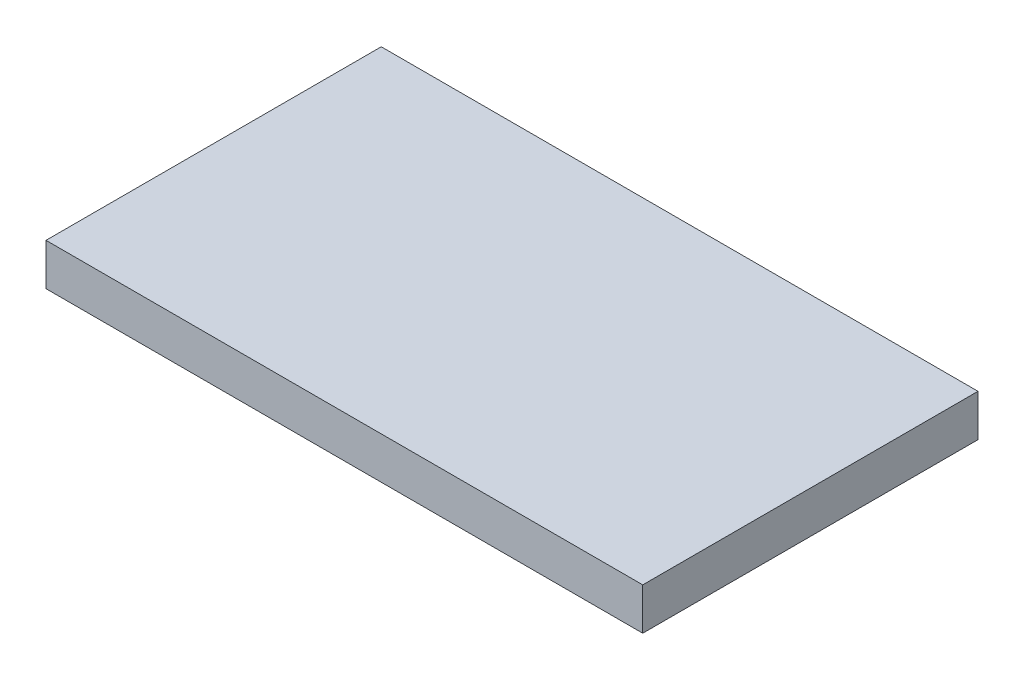
ISO-10303-21;
HEADER;
FILE_DESCRIPTION(('STEP AP214'),'2;1');
FILE_NAME('part.step','',(''),(''),'','','');
FILE_SCHEMA(('AUTOMOTIVE_DESIGN { 1 0 10303 214 1 1 1 1 }'));
ENDSEC;
DATA;
#1=APPLICATION_CONTEXT('core data for automotive mechanical design processes');
#2=APPLICATION_PROTOCOL_DEFINITION('international standard','automotive_design',2000,#1);
#3=PRODUCT_CONTEXT('',#1,'mechanical');
#4=PRODUCT('Part','Part','',(#3));
#5=PRODUCT_RELATED_PRODUCT_CATEGORY('part','',(#4));
#6=PRODUCT_DEFINITION_FORMATION('','',#4);
#7=PRODUCT_DEFINITION_CONTEXT('part definition',#1,'design');
#8=PRODUCT_DEFINITION('design','',#6,#7);
#9=PRODUCT_DEFINITION_SHAPE('','',#8);
#10=(LENGTH_UNIT() NAMED_UNIT(*) SI_UNIT(.MILLI.,.METRE.));
#11=(NAMED_UNIT(*) PLANE_ANGLE_UNIT() SI_UNIT($,.RADIAN.));
#12=(NAMED_UNIT(*) SI_UNIT($,.STERADIAN.) SOLID_ANGLE_UNIT());
#13=UNCERTAINTY_MEASURE_WITH_UNIT(LENGTH_MEASURE(1.E-05),#10,'distance_accuracy_value','');
#14=(GEOMETRIC_REPRESENTATION_CONTEXT(3) GLOBAL_UNCERTAINTY_ASSIGNED_CONTEXT((#13)) GLOBAL_UNIT_ASSIGNED_CONTEXT((#10,
#11,#12)) REPRESENTATION_CONTEXT('',''));
#15=CARTESIAN_POINT('',(0.,0.,0.));
#16=DIRECTION('',(0.,0.,1.));
#17=DIRECTION('',(1.,0.,0.));
#18=AXIS2_PLACEMENT_3D('',#15,#16,#17);
#19=CARTESIAN_POINT('',(8.9,1.25,-5.));
#20=DIRECTION('',(-1.,0.,0.));
#21=DIRECTION('',(0.,0.,1.));
#22=AXIS2_PLACEMENT_3D('',#19,#20,#21);
#23=PLANE('',#22);
#24=DIRECTION('',(0.,0.,-1.));
#25=VECTOR('',#24,1.);
#26=CARTESIAN_POINT('',(8.9,0.,-5.));
#27=LINE('',#26,#25);
#28=CARTESIAN_POINT('',(8.9,0.,5.));
#29=VERTEX_POINT('',#28);
#30=CARTESIAN_POINT('',(8.9,0.,-5.));
#31=VERTEX_POINT('',#30);
#32=EDGE_CURVE('E107',#29,#31,#27,.T.);
#33=ORIENTED_EDGE('',*,*,#32,.T.);
#34=DIRECTION('',(0.,-1.,0.));
#35=VECTOR('',#34,1.);
#36=CARTESIAN_POINT('',(8.9,1.25,-5.));
#37=LINE('',#36,#35);
#38=CARTESIAN_POINT('',(8.9,1.25,-5.));
#39=VERTEX_POINT('',#38);
#40=EDGE_CURVE('E11',#39,#31,#37,.T.);
#41=ORIENTED_EDGE('',*,*,#40,.F.);
#42=DIRECTION('',(0.,0.,-1.));
#43=VECTOR('',#42,1.);
#44=CARTESIAN_POINT('',(8.9,1.25,-5.));
#45=LINE('',#44,#43);
#46=CARTESIAN_POINT('',(8.9,1.25,5.));
#47=VERTEX_POINT('',#46);
#48=EDGE_CURVE('E91',#47,#39,#45,.T.);
#49=ORIENTED_EDGE('',*,*,#48,.F.);
#50=DIRECTION('',(0.,-1.,0.));
#51=VECTOR('',#50,1.);
#52=CARTESIAN_POINT('',(8.9,1.25,5.));
#53=LINE('',#52,#51);
#54=EDGE_CURVE('E103',#47,#29,#53,.T.);
#55=ORIENTED_EDGE('',*,*,#54,.T.);
#56=EDGE_LOOP('',(#33,#41,#49,#55));
#57=FACE_BOUND('',#56,.T.);
#58=ADVANCED_FACE('F39',(#57),#23,.F.);
#59=CARTESIAN_POINT('',(-8.9,1.25,-5.));
#60=DIRECTION('',(0.,0.,1.));
#61=DIRECTION('',(1.,0.,0.));
#62=AXIS2_PLACEMENT_3D('',#59,#60,#61);
#63=PLANE('',#62);
#64=DIRECTION('',(-1.,0.,0.));
#65=VECTOR('',#64,1.);
#66=CARTESIAN_POINT('',(-8.9,0.,-5.));
#67=LINE('',#66,#65);
#68=CARTESIAN_POINT('',(-8.9,0.,-5.));
#69=VERTEX_POINT('',#68);
#70=EDGE_CURVE('E96',#31,#69,#67,.T.);
#71=ORIENTED_EDGE('',*,*,#70,.T.);
#72=DIRECTION('',(0.,-1.,0.));
#73=VECTOR('',#72,1.);
#74=CARTESIAN_POINT('',(-8.9,1.25,-5.));
#75=LINE('',#74,#73);
#76=CARTESIAN_POINT('',(-8.9,1.25,-5.));
#77=VERTEX_POINT('',#76);
#78=EDGE_CURVE('E48',#77,#69,#75,.T.);
#79=ORIENTED_EDGE('',*,*,#78,.F.);
#80=DIRECTION('',(-1.,0.,0.));
#81=VECTOR('',#80,1.);
#82=CARTESIAN_POINT('',(-8.9,1.25,-5.));
#83=LINE('',#82,#81);
#84=EDGE_CURVE('E86',#39,#77,#83,.T.);
#85=ORIENTED_EDGE('',*,*,#84,.F.);
#86=ORIENTED_EDGE('',*,*,#40,.T.);
#87=EDGE_LOOP('',(#71,#79,#85,#86));
#88=FACE_BOUND('',#87,.T.);
#89=ADVANCED_FACE('F95',(#88),#63,.F.);
#90=CARTESIAN_POINT('',(-8.9,1.25,-5.));
#91=DIRECTION('',(1.,0.,0.));
#92=DIRECTION('',(0.,0.,-1.));
#93=AXIS2_PLACEMENT_3D('',#90,#91,#92);
#94=PLANE('',#93);
#95=DIRECTION('',(0.,0.,1.));
#96=VECTOR('',#95,1.);
#97=CARTESIAN_POINT('',(-8.9,0.,-5.));
#98=LINE('',#97,#96);
#99=CARTESIAN_POINT('',(-8.9,0.,5.));
#100=VERTEX_POINT('',#99);
#101=EDGE_CURVE('E73',#69,#100,#98,.T.);
#102=ORIENTED_EDGE('',*,*,#101,.T.);
#103=DIRECTION('',(0.,-1.,0.));
#104=VECTOR('',#103,1.);
#105=CARTESIAN_POINT('',(-8.9,1.25,5.));
#106=LINE('',#105,#104);
#107=CARTESIAN_POINT('',(-8.9,1.25,5.));
#108=VERTEX_POINT('',#107);
#109=EDGE_CURVE('E98',#108,#100,#106,.T.);
#110=ORIENTED_EDGE('',*,*,#109,.F.);
#111=DIRECTION('',(0.,0.,1.));
#112=VECTOR('',#111,1.);
#113=CARTESIAN_POINT('',(-8.9,1.25,-5.));
#114=LINE('',#113,#112);
#115=EDGE_CURVE('E89',#77,#108,#114,.T.);
#116=ORIENTED_EDGE('',*,*,#115,.F.);
#117=ORIENTED_EDGE('',*,*,#78,.T.);
#118=EDGE_LOOP('',(#102,#110,#116,#117));
#119=FACE_BOUND('',#118,.T.);
#120=ADVANCED_FACE('F99',(#119),#94,.F.);
#121=CARTESIAN_POINT('',(-8.9,1.25,5.));
#122=DIRECTION('',(0.,0.,-1.));
#123=DIRECTION('',(-1.,0.,0.));
#124=AXIS2_PLACEMENT_3D('',#121,#122,#123);
#125=PLANE('',#124);
#126=DIRECTION('',(1.,0.,0.));
#127=VECTOR('',#126,1.);
#128=CARTESIAN_POINT('',(-8.9,0.,5.));
#129=LINE('',#128,#127);
#130=EDGE_CURVE('E79',#100,#29,#129,.T.);
#131=ORIENTED_EDGE('',*,*,#130,.T.);
#132=ORIENTED_EDGE('',*,*,#54,.F.);
#133=DIRECTION('',(1.,0.,0.));
#134=VECTOR('',#133,1.);
#135=CARTESIAN_POINT('',(-8.9,1.25,5.));
#136=LINE('',#135,#134);
#137=EDGE_CURVE('E56',#108,#47,#136,.T.);
#138=ORIENTED_EDGE('',*,*,#137,.F.);
#139=ORIENTED_EDGE('',*,*,#109,.T.);
#140=EDGE_LOOP('',(#131,#132,#138,#139));
#141=FACE_BOUND('',#140,.T.);
#142=ADVANCED_FACE('F120',(#141),#125,.F.);
#143=CARTESIAN_POINT('',(0.,1.25,0.));
#144=DIRECTION('',(0.,1.,0.));
#145=DIRECTION('',(0.,0.,1.));
#146=AXIS2_PLACEMENT_3D('',#143,#144,#145);
#147=PLANE('',#146);
#148=ORIENTED_EDGE('',*,*,#48,.T.);
#149=ORIENTED_EDGE('',*,*,#84,.T.);
#150=ORIENTED_EDGE('',*,*,#115,.T.);
#151=ORIENTED_EDGE('',*,*,#137,.T.);
#152=EDGE_LOOP('',(#148,#149,#150,#151));
#153=FACE_BOUND('',#152,.T.);
#154=ADVANCED_FACE('F87',(#153),#147,.T.);
#155=CARTESIAN_POINT('',(0.,0.,0.));
#156=DIRECTION('',(0.,1.,0.));
#157=DIRECTION('',(0.,0.,1.));
#158=AXIS2_PLACEMENT_3D('',#155,#156,#157);
#159=PLANE('',#158);
#160=ORIENTED_EDGE('',*,*,#32,.F.);
#161=ORIENTED_EDGE('',*,*,#130,.F.);
#162=ORIENTED_EDGE('',*,*,#101,.F.);
#163=ORIENTED_EDGE('',*,*,#70,.F.);
#164=EDGE_LOOP('',(#160,#161,#162,#163));
#165=FACE_BOUND('',#164,.T.);
#166=ADVANCED_FACE('F123',(#165),#159,.F.);
#167=CLOSED_SHELL('',(#58,#89,#120,#142,#154,#166));
#168=MANIFOLD_SOLID_BREP('B2',#167);
#169=ADVANCED_BREP_SHAPE_REPRESENTATION('',(#18,#168),#14);
#170=SHAPE_DEFINITION_REPRESENTATION(#9,#169);
ENDSEC;
END-ISO-10303-21;
